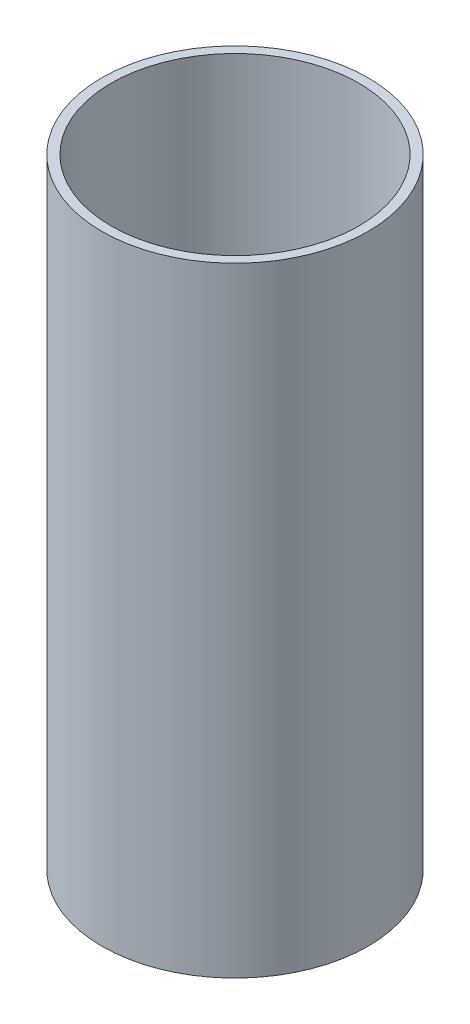
ISO-10303-21;
HEADER;
FILE_DESCRIPTION(('STEP AP214'),'2;1');
FILE_NAME('part.step','',(''),(''),'','','');
FILE_SCHEMA(('AUTOMOTIVE_DESIGN { 1 0 10303 214 1 1 1 1 }'));
ENDSEC;
DATA;
#1=APPLICATION_CONTEXT('core data for automotive mechanical design processes');
#2=APPLICATION_PROTOCOL_DEFINITION('international standard','automotive_design',2000,#1);
#3=PRODUCT_CONTEXT('',#1,'mechanical');
#4=PRODUCT('Part','Part','',(#3));
#5=PRODUCT_RELATED_PRODUCT_CATEGORY('part','',(#4));
#6=PRODUCT_DEFINITION_FORMATION('','',#4);
#7=PRODUCT_DEFINITION_CONTEXT('part definition',#1,'design');
#8=PRODUCT_DEFINITION('design','',#6,#7);
#9=PRODUCT_DEFINITION_SHAPE('','',#8);
#10=(LENGTH_UNIT() NAMED_UNIT(*) SI_UNIT(.MILLI.,.METRE.));
#11=(NAMED_UNIT(*) PLANE_ANGLE_UNIT() SI_UNIT($,.RADIAN.));
#12=(NAMED_UNIT(*) SI_UNIT($,.STERADIAN.) SOLID_ANGLE_UNIT());
#13=UNCERTAINTY_MEASURE_WITH_UNIT(LENGTH_MEASURE(1.E-05),#10,'distance_accuracy_value','');
#14=(GEOMETRIC_REPRESENTATION_CONTEXT(3) GLOBAL_UNCERTAINTY_ASSIGNED_CONTEXT((#13)) GLOBAL_UNIT_ASSIGNED_CONTEXT((#10,
#11,#12)) REPRESENTATION_CONTEXT('',''));
#15=CARTESIAN_POINT('',(0.,0.,0.));
#16=DIRECTION('',(0.,0.,1.));
#17=DIRECTION('',(1.,0.,0.));
#18=AXIS2_PLACEMENT_3D('',#15,#16,#17);
#19=CARTESIAN_POINT('',(0.,80.,0.));
#20=DIRECTION('',(0.,1.,0.));
#21=DIRECTION('',(0.,0.,1.));
#22=AXIS2_PLACEMENT_3D('',#19,#20,#21);
#23=PLANE('',#22);
#24=CARTESIAN_POINT('',(0.,80.,0.));
#25=DIRECTION('',(0.,1.,0.));
#26=DIRECTION('',(0.,0.,1.));
#27=AXIS2_PLACEMENT_3D('',#24,#25,#26);
#28=CIRCLE('',#27,17.2);
#29=CARTESIAN_POINT('',(0.,80.,17.2));
#30=VERTEX_POINT('',#29);
#31=EDGE_CURVE('E10',#30,#30,#28,.T.);
#32=ORIENTED_EDGE('',*,*,#31,.T.);
#33=EDGE_LOOP('',(#32));
#34=FACE_BOUND('',#33,.T.);
#35=CARTESIAN_POINT('',(0.,80.,0.));
#36=DIRECTION('',(0.,1.,0.));
#37=DIRECTION('',(0.,0.,1.));
#38=AXIS2_PLACEMENT_3D('',#35,#36,#37);
#39=CIRCLE('',#38,16.);
#40=CARTESIAN_POINT('',(0.,80.,16.));
#41=VERTEX_POINT('',#40);
#42=EDGE_CURVE('E46',#41,#41,#39,.T.);
#43=ORIENTED_EDGE('',*,*,#42,.F.);
#44=EDGE_LOOP('',(#43));
#45=FACE_BOUND('',#44,.T.);
#46=ADVANCED_FACE('F35',(#34,#45),#23,.T.);
#47=CARTESIAN_POINT('',(0.,0.,0.));
#48=DIRECTION('',(0.,1.,0.));
#49=DIRECTION('',(0.,0.,1.));
#50=AXIS2_PLACEMENT_3D('',#47,#48,#49);
#51=PLANE('',#50);
#52=CARTESIAN_POINT('',(0.,0.,0.));
#53=DIRECTION('',(0.,1.,0.));
#54=DIRECTION('',(0.,0.,1.));
#55=AXIS2_PLACEMENT_3D('',#52,#53,#54);
#56=CIRCLE('',#55,17.2);
#57=CARTESIAN_POINT('',(0.,0.,17.2));
#58=VERTEX_POINT('',#57);
#59=EDGE_CURVE('E39',#58,#58,#56,.T.);
#60=ORIENTED_EDGE('',*,*,#59,.F.);
#61=EDGE_LOOP('',(#60));
#62=FACE_BOUND('',#61,.T.);
#63=CARTESIAN_POINT('',(0.,0.,0.));
#64=DIRECTION('',(0.,1.,0.));
#65=DIRECTION('',(0.,0.,1.));
#66=AXIS2_PLACEMENT_3D('',#63,#64,#65);
#67=CIRCLE('',#66,16.);
#68=CARTESIAN_POINT('',(0.,0.,16.));
#69=VERTEX_POINT('',#68);
#70=EDGE_CURVE('E48',#69,#69,#67,.T.);
#71=ORIENTED_EDGE('',*,*,#70,.T.);
#72=EDGE_LOOP('',(#71));
#73=FACE_BOUND('',#72,.T.);
#74=ADVANCED_FACE('F58',(#62,#73),#51,.F.);
#75=CARTESIAN_POINT('',(0.,80.,0.));
#76=DIRECTION('',(0.,-1.,0.));
#77=DIRECTION('',(0.,0.,-1.));
#78=AXIS2_PLACEMENT_3D('',#75,#76,#77);
#79=CYLINDRICAL_SURFACE('',#78,17.2);
#80=ORIENTED_EDGE('',*,*,#31,.F.);
#81=EDGE_LOOP('',(#80));
#82=FACE_BOUND('',#81,.T.);
#83=ORIENTED_EDGE('',*,*,#59,.T.);
#84=EDGE_LOOP('',(#83));
#85=FACE_BOUND('',#84,.T.);
#86=ADVANCED_FACE('F37',(#82,#85),#79,.T.);
#87=CARTESIAN_POINT('',(0.,80.,0.));
#88=DIRECTION('',(0.,-1.,0.));
#89=DIRECTION('',(0.,0.,-1.));
#90=AXIS2_PLACEMENT_3D('',#87,#88,#89);
#91=CYLINDRICAL_SURFACE('',#90,16.);
#92=ORIENTED_EDGE('',*,*,#42,.T.);
#93=EDGE_LOOP('',(#92));
#94=FACE_BOUND('',#93,.T.);
#95=ORIENTED_EDGE('',*,*,#70,.F.);
#96=EDGE_LOOP('',(#95));
#97=FACE_BOUND('',#96,.T.);
#98=ADVANCED_FACE('F54',(#94,#97),#91,.F.);
#99=CLOSED_SHELL('',(#46,#74,#86,#98));
#100=MANIFOLD_SOLID_BREP('B2',#99);
#101=ADVANCED_BREP_SHAPE_REPRESENTATION('',(#18,#100),#14);
#102=SHAPE_DEFINITION_REPRESENTATION(#9,#101);
ENDSEC;
END-ISO-10303-21;
